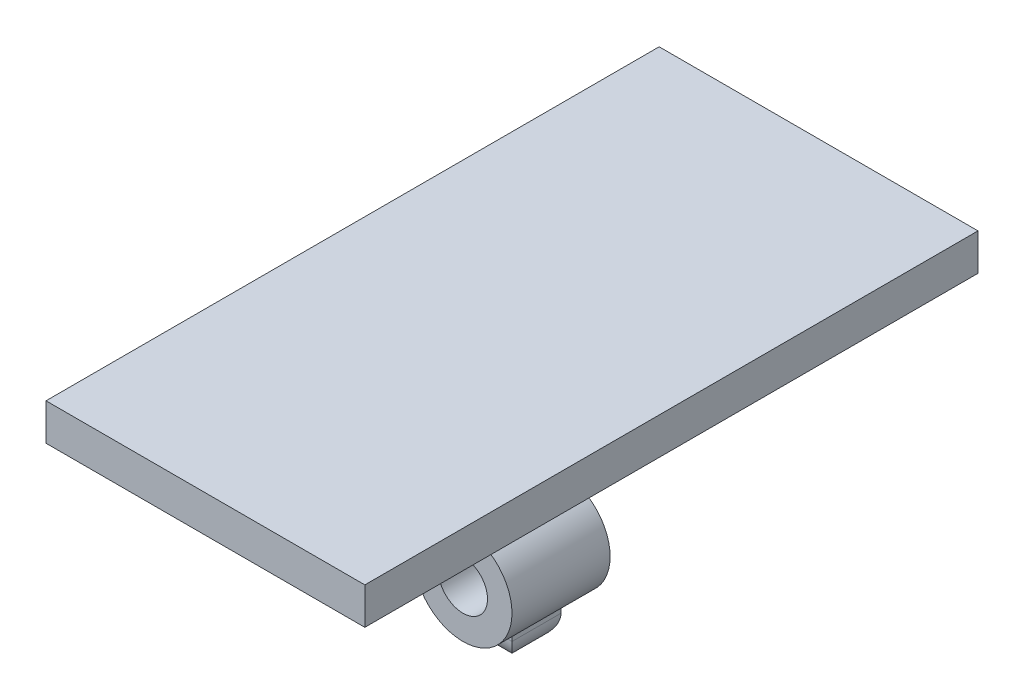
ISO-10303-21;
HEADER;
FILE_DESCRIPTION(('STEP AP214'),'2;1');
FILE_NAME('part.step','',(''),(''),'','','');
FILE_SCHEMA(('AUTOMOTIVE_DESIGN { 1 0 10303 214 1 1 1 1 }'));
ENDSEC;
DATA;
#1=APPLICATION_CONTEXT('core data for automotive mechanical design processes');
#2=APPLICATION_PROTOCOL_DEFINITION('international standard','automotive_design',2000,#1);
#3=PRODUCT_CONTEXT('',#1,'mechanical');
#4=PRODUCT('Part','Part','',(#3));
#5=PRODUCT_RELATED_PRODUCT_CATEGORY('part','',(#4));
#6=PRODUCT_DEFINITION_FORMATION('','',#4);
#7=PRODUCT_DEFINITION_CONTEXT('part definition',#1,'design');
#8=PRODUCT_DEFINITION('design','',#6,#7);
#9=PRODUCT_DEFINITION_SHAPE('','',#8);
#10=(LENGTH_UNIT() NAMED_UNIT(*) SI_UNIT(.MILLI.,.METRE.));
#11=(NAMED_UNIT(*) PLANE_ANGLE_UNIT() SI_UNIT($,.RADIAN.));
#12=(NAMED_UNIT(*) SI_UNIT($,.STERADIAN.) SOLID_ANGLE_UNIT());
#13=UNCERTAINTY_MEASURE_WITH_UNIT(LENGTH_MEASURE(1.E-05),#10,'distance_accuracy_value','');
#14=(GEOMETRIC_REPRESENTATION_CONTEXT(3) GLOBAL_UNCERTAINTY_ASSIGNED_CONTEXT((#13)) GLOBAL_UNIT_ASSIGNED_CONTEXT((#10,
#11,#12)) REPRESENTATION_CONTEXT('',''));
#15=CARTESIAN_POINT('',(0.,0.,0.));
#16=DIRECTION('',(0.,0.,1.));
#17=DIRECTION('',(1.,0.,0.));
#18=AXIS2_PLACEMENT_3D('',#15,#16,#17);
#19=CARTESIAN_POINT('',(-9.99999999999999,-107.5,135.));
#20=DIRECTION('',(0.,0.,-1.));
#21=DIRECTION('',(-1.,0.,0.));
#22=AXIS2_PLACEMENT_3D('',#19,#20,#21);
#23=PLANE('',#22);
#24=DIRECTION('',(0.,1.,0.));
#25=VECTOR('',#24,1.);
#26=CARTESIAN_POINT('',(-9.99999999999999,-107.5,135.));
#27=LINE('',#26,#25);
#28=CARTESIAN_POINT('',(-9.99999999999999,-97.5,135.));
#29=VERTEX_POINT('',#28);
#30=CARTESIAN_POINT('',(-9.99999999999998,-94.8205080756888,135.));
#31=VERTEX_POINT('',#30);
#32=EDGE_CURVE('E236',#29,#31,#27,.T.);
#33=ORIENTED_EDGE('',*,*,#32,.F.);
#34=DIRECTION('',(-1.,0.,0.));
#35=VECTOR('',#34,1.);
#36=CARTESIAN_POINT('',(10.,-97.5,135.));
#37=LINE('',#36,#35);
#38=CARTESIAN_POINT('',(0.,-97.5,135.));
#39=VERTEX_POINT('',#38);
#40=EDGE_CURVE('E54',#29,#39,#37,.F.);
#41=ORIENTED_EDGE('',*,*,#40,.T.);
#42=CARTESIAN_POINT('',(0.,-77.5,135.));
#43=DIRECTION('',(0.,0.,-1.));
#44=DIRECTION('',(-1.,0.,0.));
#45=AXIS2_PLACEMENT_3D('',#42,#43,#44);
#46=CIRCLE('',#45,20.);
#47=EDGE_CURVE('E281',#39,#31,#46,.T.);
#48=ORIENTED_EDGE('',*,*,#47,.T.);
#49=EDGE_LOOP('',(#33,#41,#48));
#50=FACE_BOUND('',#49,.T.);
#51=ADVANCED_FACE('F43',(#50),#23,.F.);
#52=CARTESIAN_POINT('',(-9.99999999999999,-107.5,115.));
#53=DIRECTION('',(0.,0.,1.));
#54=DIRECTION('',(1.,0.,0.));
#55=AXIS2_PLACEMENT_3D('',#52,#53,#54);
#56=PLANE('',#55);
#57=DIRECTION('',(0.,1.,0.));
#58=VECTOR('',#57,1.);
#59=CARTESIAN_POINT('',(10.,-107.5,115.));
#60=LINE('',#59,#58);
#61=CARTESIAN_POINT('',(10.,-97.5,115.));
#62=VERTEX_POINT('',#61);
#63=CARTESIAN_POINT('',(10.,-94.8205080756888,115.));
#64=VERTEX_POINT('',#63);
#65=EDGE_CURVE('E244',#62,#64,#60,.T.);
#66=ORIENTED_EDGE('',*,*,#65,.F.);
#67=DIRECTION('',(1.,0.,0.));
#68=VECTOR('',#67,1.);
#69=CARTESIAN_POINT('',(-9.99999999999999,-97.5,115.));
#70=LINE('',#69,#68);
#71=CARTESIAN_POINT('',(0.,-97.5,115.));
#72=VERTEX_POINT('',#71);
#73=EDGE_CURVE('E169',#62,#72,#70,.F.);
#74=ORIENTED_EDGE('',*,*,#73,.T.);
#75=CARTESIAN_POINT('',(0.,-77.5,115.));
#76=DIRECTION('',(0.,0.,1.));
#77=DIRECTION('',(1.,0.,0.));
#78=AXIS2_PLACEMENT_3D('',#75,#76,#77);
#79=CIRCLE('',#78,20.);
#80=EDGE_CURVE('E189',#72,#64,#79,.T.);
#81=ORIENTED_EDGE('',*,*,#80,.T.);
#82=EDGE_LOOP('',(#66,#74,#81));
#83=FACE_BOUND('',#82,.T.);
#84=ADVANCED_FACE('F317',(#83),#56,.F.);
#85=CARTESIAN_POINT('',(10.,-107.5,135.));
#86=DIRECTION('',(-1.,0.,0.));
#87=DIRECTION('',(0.,0.,1.));
#88=AXIS2_PLACEMENT_3D('',#85,#86,#87);
#89=PLANE('',#88);
#90=DIRECTION('',(0.,1.,0.));
#91=VECTOR('',#90,1.);
#92=CARTESIAN_POINT('',(10.,-107.5,135.));
#93=LINE('',#92,#91);
#94=CARTESIAN_POINT('',(10.,-60.1794919243112,135.));
#95=VERTEX_POINT('',#94);
#96=CARTESIAN_POINT('',(10.,-7.5,135.));
#97=VERTEX_POINT('',#96);
#98=EDGE_CURVE('E235',#95,#97,#93,.T.);
#99=ORIENTED_EDGE('',*,*,#98,.F.);
#100=DIRECTION('',(0.,0.,1.));
#101=VECTOR('',#100,1.);
#102=CARTESIAN_POINT('',(10.,-60.1794919243112,105.));
#103=LINE('',#102,#101);
#104=CARTESIAN_POINT('',(10.,-60.1794919243112,115.));
#105=VERTEX_POINT('',#104);
#106=EDGE_CURVE('E264',#95,#105,#103,.F.);
#107=ORIENTED_EDGE('',*,*,#106,.T.);
#108=CARTESIAN_POINT('',(10.,-7.5,115.));
#109=VERTEX_POINT('',#108);
#110=EDGE_CURVE('E247',#105,#109,#60,.T.);
#111=ORIENTED_EDGE('',*,*,#110,.T.);
#112=DIRECTION('',(0.,0.,1.));
#113=VECTOR('',#112,1.);
#114=CARTESIAN_POINT('',(10.,-7.5,135.));
#115=LINE('',#114,#113);
#116=EDGE_CURVE('E260',#109,#97,#115,.T.);
#117=ORIENTED_EDGE('',*,*,#116,.T.);
#118=EDGE_LOOP('',(#99,#107,#111,#117));
#119=FACE_BOUND('',#118,.T.);
#120=ADVANCED_FACE('F329',(#119),#89,.F.);
#121=CARTESIAN_POINT('',(-9.99999999999998,-60.1794919243112,135.));
#122=VERTEX_POINT('',#121);
#123=CARTESIAN_POINT('',(-9.99999999999999,-7.5,135.));
#124=VERTEX_POINT('',#123);
#125=EDGE_CURVE('E240',#122,#124,#27,.T.);
#126=ORIENTED_EDGE('',*,*,#125,.F.);
#127=EDGE_CURVE('E268',#122,#95,#46,.T.);
#128=ORIENTED_EDGE('',*,*,#127,.T.);
#129=ORIENTED_EDGE('',*,*,#98,.T.);
#130=DIRECTION('',(-1.,0.,0.));
#131=VECTOR('',#130,1.);
#132=CARTESIAN_POINT('',(-9.99999999999999,-7.5,135.));
#133=LINE('',#132,#131);
#134=EDGE_CURVE('E256',#97,#124,#133,.T.);
#135=ORIENTED_EDGE('',*,*,#134,.T.);
#136=EDGE_LOOP('',(#126,#128,#129,#135));
#137=FACE_BOUND('',#136,.T.);
#138=ADVANCED_FACE('F324',(#137),#23,.F.);
#139=ORIENTED_EDGE('',*,*,#110,.F.);
#140=CARTESIAN_POINT('',(-9.99999999999999,-60.1794919243112,115.));
#141=VERTEX_POINT('',#140);
#142=EDGE_CURVE('E185',#105,#141,#79,.T.);
#143=ORIENTED_EDGE('',*,*,#142,.T.);
#144=DIRECTION('',(0.,1.,0.));
#145=VECTOR('',#144,1.);
#146=CARTESIAN_POINT('',(-9.99999999999999,-107.5,115.));
#147=LINE('',#146,#145);
#148=CARTESIAN_POINT('',(-9.99999999999998,-7.5,115.));
#149=VERTEX_POINT('',#148);
#150=EDGE_CURVE('E243',#141,#149,#147,.T.);
#151=ORIENTED_EDGE('',*,*,#150,.T.);
#152=DIRECTION('',(1.,0.,0.));
#153=VECTOR('',#152,1.);
#154=CARTESIAN_POINT('',(-9.99999999999999,-7.5,115.));
#155=LINE('',#154,#153);
#156=EDGE_CURVE('E248',#149,#109,#155,.T.);
#157=ORIENTED_EDGE('',*,*,#156,.T.);
#158=EDGE_LOOP('',(#139,#143,#151,#157));
#159=FACE_BOUND('',#158,.T.);
#160=ADVANCED_FACE('F318',(#159),#56,.F.);
#161=CARTESIAN_POINT('',(-65.,-7.5,250.));
#162=DIRECTION('',(0.,1.,0.));
#163=DIRECTION('',(0.,0.,1.));
#164=AXIS2_PLACEMENT_3D('',#161,#162,#163);
#165=PLANE('',#164);
#166=DIRECTION('',(1.,0.,0.));
#167=VECTOR('',#166,1.);
#168=CARTESIAN_POINT('',(-65.,-7.5,0.));
#169=LINE('',#168,#167);
#170=CARTESIAN_POINT('',(-65.,-7.5,0.));
#171=VERTEX_POINT('',#170);
#172=CARTESIAN_POINT('',(65.,-7.5,0.));
#173=VERTEX_POINT('',#172);
#174=EDGE_CURVE('E207',#171,#173,#169,.T.);
#175=ORIENTED_EDGE('',*,*,#174,.T.);
#176=DIRECTION('',(0.,0.,-1.));
#177=VECTOR('',#176,1.);
#178=CARTESIAN_POINT('',(65.,-7.5,250.));
#179=LINE('',#178,#177);
#180=CARTESIAN_POINT('',(65.,-7.5,250.));
#181=VERTEX_POINT('',#180);
#182=EDGE_CURVE('E202',#181,#173,#179,.T.);
#183=ORIENTED_EDGE('',*,*,#182,.F.);
#184=DIRECTION('',(1.,0.,0.));
#185=VECTOR('',#184,1.);
#186=CARTESIAN_POINT('',(-65.,-7.5,250.));
#187=LINE('',#186,#185);
#188=CARTESIAN_POINT('',(-65.,-7.5,250.));
#189=VERTEX_POINT('',#188);
#190=EDGE_CURVE('E206',#189,#181,#187,.T.);
#191=ORIENTED_EDGE('',*,*,#190,.F.);
#192=DIRECTION('',(0.,0.,-1.));
#193=VECTOR('',#192,1.);
#194=CARTESIAN_POINT('',(-65.,-7.5,250.));
#195=LINE('',#194,#193);
#196=EDGE_CURVE('E198',#189,#171,#195,.T.);
#197=ORIENTED_EDGE('',*,*,#196,.T.);
#198=EDGE_LOOP('',(#175,#183,#191,#197));
#199=FACE_BOUND('',#198,.T.);
#200=ORIENTED_EDGE('',*,*,#116,.F.);
#201=ORIENTED_EDGE('',*,*,#156,.F.);
#202=DIRECTION('',(0.,0.,-1.));
#203=VECTOR('',#202,1.);
#204=CARTESIAN_POINT('',(-9.99999999999999,-7.5,135.));
#205=LINE('',#204,#203);
#206=EDGE_CURVE('E252',#124,#149,#205,.T.);
#207=ORIENTED_EDGE('',*,*,#206,.F.);
#208=ORIENTED_EDGE('',*,*,#134,.F.);
#209=EDGE_LOOP('',(#200,#201,#207,#208));
#210=FACE_BOUND('',#209,.T.);
#211=ADVANCED_FACE('F378',(#199,#210),#165,.F.);
#212=CARTESIAN_POINT('',(65.,-7.5,250.));
#213=DIRECTION('',(-1.,0.,0.));
#214=DIRECTION('',(0.,0.,1.));
#215=AXIS2_PLACEMENT_3D('',#212,#213,#214);
#216=PLANE('',#215);
#217=DIRECTION('',(0.,1.,0.));
#218=VECTOR('',#217,1.);
#219=CARTESIAN_POINT('',(65.,-7.5,0.));
#220=LINE('',#219,#218);
#221=CARTESIAN_POINT('',(65.,7.5,0.));
#222=VERTEX_POINT('',#221);
#223=EDGE_CURVE('E217',#173,#222,#220,.T.);
#224=ORIENTED_EDGE('',*,*,#223,.T.);
#225=DIRECTION('',(0.,0.,-1.));
#226=VECTOR('',#225,1.);
#227=CARTESIAN_POINT('',(65.,7.5,250.));
#228=LINE('',#227,#226);
#229=CARTESIAN_POINT('',(65.,7.5,250.));
#230=VERTEX_POINT('',#229);
#231=EDGE_CURVE('E190',#230,#222,#228,.T.);
#232=ORIENTED_EDGE('',*,*,#231,.F.);
#233=DIRECTION('',(0.,1.,0.));
#234=VECTOR('',#233,1.);
#235=CARTESIAN_POINT('',(65.,-7.5,250.));
#236=LINE('',#235,#234);
#237=EDGE_CURVE('E210',#181,#230,#236,.T.);
#238=ORIENTED_EDGE('',*,*,#237,.F.);
#239=ORIENTED_EDGE('',*,*,#182,.T.);
#240=EDGE_LOOP('',(#224,#232,#238,#239));
#241=FACE_BOUND('',#240,.T.);
#242=ADVANCED_FACE('F380',(#241),#216,.F.);
#243=CARTESIAN_POINT('',(-65.,7.5,250.));
#244=DIRECTION('',(0.,-1.,0.));
#245=DIRECTION('',(0.,0.,-1.));
#246=AXIS2_PLACEMENT_3D('',#243,#244,#245);
#247=PLANE('',#246);
#248=DIRECTION('',(-1.,0.,0.));
#249=VECTOR('',#248,1.);
#250=CARTESIAN_POINT('',(-65.,7.5,0.));
#251=LINE('',#250,#249);
#252=CARTESIAN_POINT('',(-65.,7.5,0.));
#253=VERTEX_POINT('',#252);
#254=EDGE_CURVE('E214',#222,#253,#251,.T.);
#255=ORIENTED_EDGE('',*,*,#254,.T.);
#256=DIRECTION('',(0.,0.,-1.));
#257=VECTOR('',#256,1.);
#258=CARTESIAN_POINT('',(-65.,7.5,250.));
#259=LINE('',#258,#257);
#260=CARTESIAN_POINT('',(-65.,7.5,250.));
#261=VERTEX_POINT('',#260);
#262=EDGE_CURVE('E194',#261,#253,#259,.T.);
#263=ORIENTED_EDGE('',*,*,#262,.F.);
#264=DIRECTION('',(-1.,0.,0.));
#265=VECTOR('',#264,1.);
#266=CARTESIAN_POINT('',(-65.,7.5,250.));
#267=LINE('',#266,#265);
#268=EDGE_CURVE('E227',#230,#261,#267,.T.);
#269=ORIENTED_EDGE('',*,*,#268,.F.);
#270=ORIENTED_EDGE('',*,*,#231,.T.);
#271=EDGE_LOOP('',(#255,#263,#269,#270));
#272=FACE_BOUND('',#271,.T.);
#273=ADVANCED_FACE('F387',(#272),#247,.F.);
#274=CARTESIAN_POINT('',(-65.,-7.5,250.));
#275=DIRECTION('',(1.,0.,0.));
#276=DIRECTION('',(0.,0.,-1.));
#277=AXIS2_PLACEMENT_3D('',#274,#275,#276);
#278=PLANE('',#277);
#279=DIRECTION('',(0.,-1.,0.));
#280=VECTOR('',#279,1.);
#281=CARTESIAN_POINT('',(-65.,-7.5,0.));
#282=LINE('',#281,#280);
#283=EDGE_CURVE('E211',#253,#171,#282,.T.);
#284=ORIENTED_EDGE('',*,*,#283,.T.);
#285=ORIENTED_EDGE('',*,*,#196,.F.);
#286=DIRECTION('',(0.,-1.,0.));
#287=VECTOR('',#286,1.);
#288=CARTESIAN_POINT('',(-65.,-7.5,250.));
#289=LINE('',#288,#287);
#290=EDGE_CURVE('E224',#261,#189,#289,.T.);
#291=ORIENTED_EDGE('',*,*,#290,.F.);
#292=ORIENTED_EDGE('',*,*,#262,.T.);
#293=EDGE_LOOP('',(#284,#285,#291,#292));
#294=FACE_BOUND('',#293,.T.);
#295=ADVANCED_FACE('F394',(#294),#278,.F.);
#296=CARTESIAN_POINT('',(0.,0.,250.));
#297=DIRECTION('',(0.,0.,-1.));
#298=DIRECTION('',(-1.,0.,0.));
#299=AXIS2_PLACEMENT_3D('',#296,#297,#298);
#300=PLANE('',#299);
#301=ORIENTED_EDGE('',*,*,#237,.T.);
#302=ORIENTED_EDGE('',*,*,#268,.T.);
#303=ORIENTED_EDGE('',*,*,#290,.T.);
#304=ORIENTED_EDGE('',*,*,#190,.T.);
#305=EDGE_LOOP('',(#301,#302,#303,#304));
#306=FACE_BOUND('',#305,.T.);
#307=ADVANCED_FACE('F397',(#306),#300,.F.);
#308=CARTESIAN_POINT('',(0.,0.,0.));
#309=DIRECTION('',(0.,0.,-1.));
#310=DIRECTION('',(-1.,0.,0.));
#311=AXIS2_PLACEMENT_3D('',#308,#309,#310);
#312=PLANE('',#311);
#313=ORIENTED_EDGE('',*,*,#223,.F.);
#314=ORIENTED_EDGE('',*,*,#174,.F.);
#315=ORIENTED_EDGE('',*,*,#283,.F.);
#316=ORIENTED_EDGE('',*,*,#254,.F.);
#317=EDGE_LOOP('',(#313,#314,#315,#316));
#318=FACE_BOUND('',#317,.T.);
#319=ADVANCED_FACE('F392',(#318),#312,.T.);
#320=CARTESIAN_POINT('',(-9.99999999999999,-107.5,135.));
#321=DIRECTION('',(1.,0.,0.));
#322=DIRECTION('',(0.,0.,-1.));
#323=AXIS2_PLACEMENT_3D('',#320,#321,#322);
#324=PLANE('',#323);
#325=ORIENTED_EDGE('',*,*,#150,.F.);
#326=DIRECTION('',(0.,0.,1.));
#327=VECTOR('',#326,1.);
#328=CARTESIAN_POINT('',(-9.99999999999998,-60.1794919243112,105.));
#329=LINE('',#328,#327);
#330=EDGE_CURVE('E269',#141,#122,#329,.T.);
#331=ORIENTED_EDGE('',*,*,#330,.T.);
#332=ORIENTED_EDGE('',*,*,#125,.T.);
#333=ORIENTED_EDGE('',*,*,#206,.T.);
#334=EDGE_LOOP('',(#325,#331,#332,#333));
#335=FACE_BOUND('',#334,.T.);
#336=ADVANCED_FACE('F344',(#335),#324,.F.);
#337=CARTESIAN_POINT('',(0.,-77.5,105.));
#338=DIRECTION('',(0.,0.,1.));
#339=DIRECTION('',(1.,0.,0.));
#340=AXIS2_PLACEMENT_3D('',#337,#338,#339);
#341=CYLINDRICAL_SURFACE('',#340,20.);
#342=DIRECTION('',(0.,0.,1.));
#343=VECTOR('',#342,1.);
#344=CARTESIAN_POINT('',(10.,-94.8205080756888,105.));
#345=LINE('',#344,#343);
#346=CARTESIAN_POINT('',(10.,-94.8205080756888,135.));
#347=VERTEX_POINT('',#346);
#348=EDGE_CURVE('E273',#64,#347,#345,.T.);
#349=ORIENTED_EDGE('',*,*,#348,.F.);
#350=ORIENTED_EDGE('',*,*,#80,.F.);
#351=CARTESIAN_POINT('',(-9.99999999999999,-94.8205080756888,115.));
#352=VERTEX_POINT('',#351);
#353=EDGE_CURVE('E186',#352,#72,#79,.T.);
#354=ORIENTED_EDGE('',*,*,#353,.F.);
#355=DIRECTION('',(0.,0.,1.));
#356=VECTOR('',#355,1.);
#357=CARTESIAN_POINT('',(-9.99999999999998,-94.8205080756888,105.));
#358=LINE('',#357,#356);
#359=EDGE_CURVE('E282',#31,#352,#358,.F.);
#360=ORIENTED_EDGE('',*,*,#359,.F.);
#361=ORIENTED_EDGE('',*,*,#47,.F.);
#362=EDGE_CURVE('E277',#347,#39,#46,.T.);
#363=ORIENTED_EDGE('',*,*,#362,.F.);
#364=EDGE_LOOP('',(#349,#350,#354,#360,#361,#363));
#365=FACE_BOUND('',#364,.T.);
#366=CARTESIAN_POINT('',(0.,-77.5,105.));
#367=DIRECTION('',(0.,0.,1.));
#368=DIRECTION('',(1.,0.,0.));
#369=AXIS2_PLACEMENT_3D('',#366,#367,#368);
#370=CIRCLE('',#369,20.);
#371=CARTESIAN_POINT('',(20.,-77.5,105.));
#372=VERTEX_POINT('',#371);
#373=EDGE_CURVE('E286',#372,#372,#370,.T.);
#374=ORIENTED_EDGE('',*,*,#373,.T.);
#375=EDGE_LOOP('',(#374));
#376=FACE_BOUND('',#375,.T.);
#377=CARTESIAN_POINT('',(0.,-77.5,145.));
#378=DIRECTION('',(0.,0.,1.));
#379=DIRECTION('',(1.,0.,0.));
#380=AXIS2_PLACEMENT_3D('',#377,#378,#379);
#381=CIRCLE('',#380,20.);
#382=CARTESIAN_POINT('',(20.,-77.5,145.));
#383=VERTEX_POINT('',#382);
#384=EDGE_CURVE('E294',#383,#383,#381,.T.);
#385=ORIENTED_EDGE('',*,*,#384,.F.);
#386=EDGE_LOOP('',(#385));
#387=FACE_BOUND('',#386,.T.);
#388=ORIENTED_EDGE('',*,*,#106,.F.);
#389=ORIENTED_EDGE('',*,*,#127,.F.);
#390=ORIENTED_EDGE('',*,*,#330,.F.);
#391=ORIENTED_EDGE('',*,*,#142,.F.);
#392=EDGE_LOOP('',(#388,#389,#390,#391));
#393=FACE_BOUND('',#392,.T.);
#394=ADVANCED_FACE('F349',(#365,#376,#387,#393),#341,.T.);
#395=CARTESIAN_POINT('',(0.,-77.5,105.));
#396=DIRECTION('',(0.,0.,1.));
#397=DIRECTION('',(1.,0.,0.));
#398=AXIS2_PLACEMENT_3D('',#395,#396,#397);
#399=CYLINDRICAL_SURFACE('',#398,10.);
#400=CARTESIAN_POINT('',(0.,-77.5,145.));
#401=DIRECTION('',(0.,0.,1.));
#402=DIRECTION('',(1.,0.,0.));
#403=AXIS2_PLACEMENT_3D('',#400,#401,#402);
#404=CIRCLE('',#403,10.);
#405=CARTESIAN_POINT('',(10.,-77.5,145.));
#406=VERTEX_POINT('',#405);
#407=EDGE_CURVE('E152',#406,#406,#404,.T.);
#408=ORIENTED_EDGE('',*,*,#407,.T.);
#409=EDGE_LOOP('',(#408));
#410=FACE_BOUND('',#409,.T.);
#411=CARTESIAN_POINT('',(0.,-77.5,105.));
#412=DIRECTION('',(0.,0.,1.));
#413=DIRECTION('',(1.,0.,0.));
#414=AXIS2_PLACEMENT_3D('',#411,#412,#413);
#415=CIRCLE('',#414,10.);
#416=CARTESIAN_POINT('',(10.,-77.5,105.));
#417=VERTEX_POINT('',#416);
#418=EDGE_CURVE('E290',#417,#417,#415,.T.);
#419=ORIENTED_EDGE('',*,*,#418,.F.);
#420=EDGE_LOOP('',(#419));
#421=FACE_BOUND('',#420,.T.);
#422=ADVANCED_FACE('F302',(#410,#421),#399,.F.);
#423=CARTESIAN_POINT('',(0.,-77.5,105.));
#424=DIRECTION('',(0.,0.,1.));
#425=DIRECTION('',(1.,0.,0.));
#426=AXIS2_PLACEMENT_3D('',#423,#424,#425);
#427=PLANE('',#426);
#428=ORIENTED_EDGE('',*,*,#418,.T.);
#429=EDGE_LOOP('',(#428));
#430=FACE_BOUND('',#429,.T.);
#431=ORIENTED_EDGE('',*,*,#373,.F.);
#432=EDGE_LOOP('',(#431));
#433=FACE_BOUND('',#432,.T.);
#434=ADVANCED_FACE('F308',(#430,#433),#427,.F.);
#435=CARTESIAN_POINT('',(0.,-77.5,145.));
#436=DIRECTION('',(0.,0.,1.));
#437=DIRECTION('',(1.,0.,0.));
#438=AXIS2_PLACEMENT_3D('',#435,#436,#437);
#439=PLANE('',#438);
#440=ORIENTED_EDGE('',*,*,#384,.T.);
#441=EDGE_LOOP('',(#440));
#442=FACE_BOUND('',#441,.T.);
#443=ORIENTED_EDGE('',*,*,#407,.F.);
#444=EDGE_LOOP('',(#443));
#445=FACE_BOUND('',#444,.T.);
#446=ADVANCED_FACE('F305',(#442,#445),#439,.T.);
#447=ORIENTED_EDGE('',*,*,#353,.T.);
#448=DIRECTION('',(1.,0.,0.));
#449=VECTOR('',#448,1.);
#450=CARTESIAN_POINT('',(-9.99999999999999,-97.5,115.));
#451=LINE('',#450,#449);
#452=CARTESIAN_POINT('',(-9.99999999999999,-97.5,115.));
#453=VERTEX_POINT('',#452);
#454=EDGE_CURVE('E182',#72,#453,#451,.F.);
#455=ORIENTED_EDGE('',*,*,#454,.T.);
#456=EDGE_CURVE('E138',#453,#352,#147,.T.);
#457=ORIENTED_EDGE('',*,*,#456,.T.);
#458=EDGE_LOOP('',(#447,#455,#457));
#459=FACE_BOUND('',#458,.T.);
#460=ADVANCED_FACE('F307',(#459),#56,.F.);
#461=ORIENTED_EDGE('',*,*,#456,.F.);
#462=DIRECTION('',(0.,0.,-1.));
#463=VECTOR('',#462,1.);
#464=CARTESIAN_POINT('',(-9.99999999999999,-97.5,135.));
#465=LINE('',#464,#463);
#466=EDGE_CURVE('E162',#453,#29,#465,.F.);
#467=ORIENTED_EDGE('',*,*,#466,.T.);
#468=ORIENTED_EDGE('',*,*,#32,.T.);
#469=ORIENTED_EDGE('',*,*,#359,.T.);
#470=EDGE_LOOP('',(#461,#467,#468,#469));
#471=FACE_BOUND('',#470,.T.);
#472=ADVANCED_FACE('F315',(#471),#324,.F.);
#473=ORIENTED_EDGE('',*,*,#362,.T.);
#474=DIRECTION('',(-1.,0.,0.));
#475=VECTOR('',#474,1.);
#476=CARTESIAN_POINT('',(10.,-97.5,135.));
#477=LINE('',#476,#475);
#478=CARTESIAN_POINT('',(10.,-97.5,135.));
#479=VERTEX_POINT('',#478);
#480=EDGE_CURVE('E175',#39,#479,#477,.F.);
#481=ORIENTED_EDGE('',*,*,#480,.T.);
#482=EDGE_CURVE('E221',#479,#347,#93,.T.);
#483=ORIENTED_EDGE('',*,*,#482,.T.);
#484=EDGE_LOOP('',(#473,#481,#483));
#485=FACE_BOUND('',#484,.T.);
#486=ADVANCED_FACE('F325',(#485),#23,.F.);
#487=ORIENTED_EDGE('',*,*,#482,.F.);
#488=DIRECTION('',(0.,0.,1.));
#489=VECTOR('',#488,1.);
#490=CARTESIAN_POINT('',(10.,-97.5,115.));
#491=LINE('',#490,#489);
#492=EDGE_CURVE('E11',#479,#62,#491,.F.);
#493=ORIENTED_EDGE('',*,*,#492,.T.);
#494=ORIENTED_EDGE('',*,*,#65,.T.);
#495=ORIENTED_EDGE('',*,*,#348,.T.);
#496=EDGE_LOOP('',(#487,#493,#494,#495));
#497=FACE_BOUND('',#496,.T.);
#498=ADVANCED_FACE('F336',(#497),#89,.F.);
#499=CARTESIAN_POINT('',(0.,-97.5,125.));
#500=DIRECTION('',(1.,0.,0.));
#501=DIRECTION('',(0.,0.,-1.));
#502=AXIS2_PLACEMENT_3D('',#499,#500,#501);
#503=CYLINDRICAL_SURFACE('',#502,10.);
#504=ORIENTED_EDGE('',*,*,#480,.F.);
#505=ORIENTED_EDGE('',*,*,#40,.F.);
#506=CARTESIAN_POINT('',(0.,-97.5,125.));
#507=DIRECTION('',(0.707106781186547,0.,0.707106781186548));
#508=DIRECTION('',(0.707106781186548,0.,-0.707106781186547));
#509=AXIS2_PLACEMENT_3D('',#506,#507,#508);
#510=ELLIPSE('',#509,14.142135623731,10.);
#511=CARTESIAN_POINT('',(0.,-107.5,125.));
#512=VERTEX_POINT('',#511);
#513=EDGE_CURVE('E47',#512,#29,#510,.F.);
#514=ORIENTED_EDGE('',*,*,#513,.F.);
#515=CARTESIAN_POINT('',(0.,-97.5,125.));
#516=DIRECTION('',(0.707106781186548,0.,-0.707106781186547));
#517=DIRECTION('',(-0.707106781186547,0.,-0.707106781186548));
#518=AXIS2_PLACEMENT_3D('',#515,#516,#517);
#519=ELLIPSE('',#518,14.1421356237309,10.);
#520=EDGE_CURVE('E146',#479,#512,#519,.T.);
#521=ORIENTED_EDGE('',*,*,#520,.F.);
#522=EDGE_LOOP('',(#504,#505,#514,#521));
#523=FACE_BOUND('',#522,.T.);
#524=ADVANCED_FACE('F45',(#523),#503,.T.);
#525=CARTESIAN_POINT('',(0.,-97.5,0.));
#526=DIRECTION('',(0.,0.,1.));
#527=DIRECTION('',(1.,0.,0.));
#528=AXIS2_PLACEMENT_3D('',#525,#526,#527);
#529=CYLINDRICAL_SURFACE('',#528,10.);
#530=ORIENTED_EDGE('',*,*,#513,.T.);
#531=ORIENTED_EDGE('',*,*,#466,.F.);
#532=CARTESIAN_POINT('',(0.,-97.5,125.));
#533=DIRECTION('',(-0.707106781186548,0.,0.707106781186547));
#534=DIRECTION('',(0.707106781186547,0.,0.707106781186548));
#535=AXIS2_PLACEMENT_3D('',#532,#533,#534);
#536=ELLIPSE('',#535,14.1421356237309,10.);
#537=EDGE_CURVE('E159',#512,#453,#536,.F.);
#538=ORIENTED_EDGE('',*,*,#537,.F.);
#539=EDGE_LOOP('',(#530,#531,#538));
#540=FACE_BOUND('',#539,.T.);
#541=ADVANCED_FACE('F161',(#540),#529,.T.);
#542=CARTESIAN_POINT('',(0.,-97.5,0.));
#543=DIRECTION('',(0.,0.,-1.));
#544=DIRECTION('',(-1.,0.,0.));
#545=AXIS2_PLACEMENT_3D('',#542,#543,#544);
#546=CYLINDRICAL_SURFACE('',#545,10.);
#547=ORIENTED_EDGE('',*,*,#492,.F.);
#548=ORIENTED_EDGE('',*,*,#520,.T.);
#549=CARTESIAN_POINT('',(0.,-97.5,125.));
#550=DIRECTION('',(-0.707106781186547,0.,-0.707106781186548));
#551=DIRECTION('',(0.707106781186548,0.,-0.707106781186547));
#552=AXIS2_PLACEMENT_3D('',#549,#550,#551);
#553=ELLIPSE('',#552,14.142135623731,10.);
#554=EDGE_CURVE('E157',#62,#512,#553,.T.);
#555=ORIENTED_EDGE('',*,*,#554,.F.);
#556=EDGE_LOOP('',(#547,#548,#555));
#557=FACE_BOUND('',#556,.T.);
#558=ADVANCED_FACE('F155',(#557),#546,.T.);
#559=CARTESIAN_POINT('',(0.,-97.5,125.));
#560=DIRECTION('',(-1.,0.,0.));
#561=DIRECTION('',(0.,0.,1.));
#562=AXIS2_PLACEMENT_3D('',#559,#560,#561);
#563=CYLINDRICAL_SURFACE('',#562,10.);
#564=ORIENTED_EDGE('',*,*,#454,.F.);
#565=ORIENTED_EDGE('',*,*,#73,.F.);
#566=ORIENTED_EDGE('',*,*,#554,.T.);
#567=ORIENTED_EDGE('',*,*,#537,.T.);
#568=EDGE_LOOP('',(#564,#565,#566,#567));
#569=FACE_BOUND('',#568,.T.);
#570=ADVANCED_FACE('F167',(#569),#563,.T.);
#571=CLOSED_SHELL('',(#51,#84,#120,#138,#160,#211,#242,#273,#295,#307,#319,#336,#394,#422,#434,
#446,#460,#472,#486,#498,#524,#541,#558,#570));
#572=MANIFOLD_SOLID_BREP('B2',#571);
#573=ADVANCED_BREP_SHAPE_REPRESENTATION('',(#18,#572),#14);
#574=SHAPE_DEFINITION_REPRESENTATION(#9,#573);
ENDSEC;
END-ISO-10303-21;
